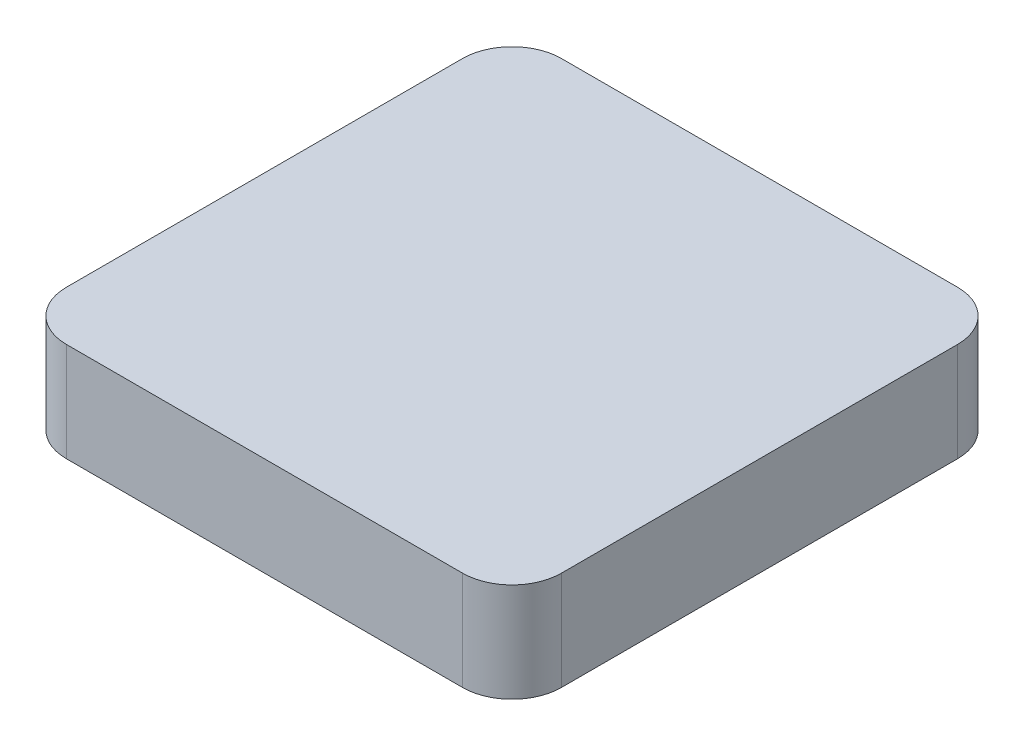
ISO-10303-21;
HEADER;
FILE_DESCRIPTION(('STEP AP214'),'2;1');
FILE_NAME('part.step','',(''),(''),'','','');
FILE_SCHEMA(('AUTOMOTIVE_DESIGN { 1 0 10303 214 1 1 1 1 }'));
ENDSEC;
DATA;
#1=APPLICATION_CONTEXT('core data for automotive mechanical design processes');
#2=APPLICATION_PROTOCOL_DEFINITION('international standard','automotive_design',2000,#1);
#3=PRODUCT_CONTEXT('',#1,'mechanical');
#4=PRODUCT('Part','Part','',(#3));
#5=PRODUCT_RELATED_PRODUCT_CATEGORY('part','',(#4));
#6=PRODUCT_DEFINITION_FORMATION('','',#4);
#7=PRODUCT_DEFINITION_CONTEXT('part definition',#1,'design');
#8=PRODUCT_DEFINITION('design','',#6,#7);
#9=PRODUCT_DEFINITION_SHAPE('','',#8);
#10=(LENGTH_UNIT() NAMED_UNIT(*) SI_UNIT(.MILLI.,.METRE.));
#11=(NAMED_UNIT(*) PLANE_ANGLE_UNIT() SI_UNIT($,.RADIAN.));
#12=(NAMED_UNIT(*) SI_UNIT($,.STERADIAN.) SOLID_ANGLE_UNIT());
#13=UNCERTAINTY_MEASURE_WITH_UNIT(LENGTH_MEASURE(1.E-05),#10,'distance_accuracy_value','');
#14=(GEOMETRIC_REPRESENTATION_CONTEXT(3) GLOBAL_UNCERTAINTY_ASSIGNED_CONTEXT((#13)) GLOBAL_UNIT_ASSIGNED_CONTEXT((#10,
#11,#12)) REPRESENTATION_CONTEXT('',''));
#15=CARTESIAN_POINT('',(0.,0.,0.));
#16=DIRECTION('',(0.,0.,1.));
#17=DIRECTION('',(1.,0.,0.));
#18=AXIS2_PLACEMENT_3D('',#15,#16,#17);
#19=CARTESIAN_POINT('',(-121.242683267555,1.,-137.570933988502));
#20=DIRECTION('',(1.,0.,0.));
#21=DIRECTION('',(0.,1.,0.));
#22=AXIS2_PLACEMENT_3D('',#19,#20,#21);
#23=PLANE('',#22);
#24=DIRECTION('',(0.,0.,1.));
#25=VECTOR('',#24,1.);
#26=CARTESIAN_POINT('',(-121.242683267555,0.,-137.570933988502));
#27=LINE('',#26,#25);
#28=CARTESIAN_POINT('',(-121.242683267555,0.,-137.070933988502));
#29=VERTEX_POINT('',#28);
#30=CARTESIAN_POINT('',(-121.242683267555,0.,-133.070933988502));
#31=VERTEX_POINT('',#30);
#32=EDGE_CURVE('E10',#29,#31,#27,.T.);
#33=ORIENTED_EDGE('',*,*,#32,.T.);
#34=DIRECTION('',(0.,1.,0.));
#35=VECTOR('',#34,1.);
#36=CARTESIAN_POINT('',(-121.242683267555,1.,-133.070933988502));
#37=LINE('',#36,#35);
#38=CARTESIAN_POINT('',(-121.242683267555,1.,-133.070933988502));
#39=VERTEX_POINT('',#38);
#40=EDGE_CURVE('E26',#31,#39,#37,.T.);
#41=ORIENTED_EDGE('',*,*,#40,.T.);
#42=DIRECTION('',(0.,0.,1.));
#43=VECTOR('',#42,1.);
#44=CARTESIAN_POINT('',(-121.242683267555,1.,-137.570933988502));
#45=LINE('',#44,#43);
#46=CARTESIAN_POINT('',(-121.242683267555,1.,-137.070933988502));
#47=VERTEX_POINT('',#46);
#48=EDGE_CURVE('E137',#47,#39,#45,.T.);
#49=ORIENTED_EDGE('',*,*,#48,.F.);
#50=DIRECTION('',(0.,-1.,0.));
#51=VECTOR('',#50,1.);
#52=CARTESIAN_POINT('',(-121.242683267555,1.,-137.070933988502));
#53=LINE('',#52,#51);
#54=EDGE_CURVE('E166',#47,#29,#53,.T.);
#55=ORIENTED_EDGE('',*,*,#54,.T.);
#56=EDGE_LOOP('',(#33,#41,#49,#55));
#57=FACE_BOUND('',#56,.T.);
#58=ADVANCED_FACE('F15',(#57),#23,.F.);
#59=CARTESIAN_POINT('',(-121.242683267555,1.,-132.570933988502));
#60=DIRECTION('',(0.,0.,-1.));
#61=DIRECTION('',(0.,-1.,0.));
#62=AXIS2_PLACEMENT_3D('',#59,#60,#61);
#63=PLANE('',#62);
#64=DIRECTION('',(1.,0.,0.));
#65=VECTOR('',#64,1.);
#66=CARTESIAN_POINT('',(-121.242683267555,0.,-132.570933988502));
#67=LINE('',#66,#65);
#68=CARTESIAN_POINT('',(-120.742683267555,0.,-132.570933988502));
#69=VERTEX_POINT('',#68);
#70=CARTESIAN_POINT('',(-116.742683267555,0.,-132.570933988502));
#71=VERTEX_POINT('',#70);
#72=EDGE_CURVE('E163',#69,#71,#67,.T.);
#73=ORIENTED_EDGE('',*,*,#72,.T.);
#74=DIRECTION('',(0.,1.,0.));
#75=VECTOR('',#74,1.);
#76=CARTESIAN_POINT('',(-116.742683267555,1.,-132.570933988502));
#77=LINE('',#76,#75);
#78=CARTESIAN_POINT('',(-116.742683267555,1.,-132.570933988502));
#79=VERTEX_POINT('',#78);
#80=EDGE_CURVE('E122',#71,#79,#77,.T.);
#81=ORIENTED_EDGE('',*,*,#80,.T.);
#82=DIRECTION('',(1.,0.,0.));
#83=VECTOR('',#82,1.);
#84=CARTESIAN_POINT('',(-121.242683267555,1.,-132.570933988502));
#85=LINE('',#84,#83);
#86=CARTESIAN_POINT('',(-120.742683267555,1.,-132.570933988502));
#87=VERTEX_POINT('',#86);
#88=EDGE_CURVE('E116',#87,#79,#85,.T.);
#89=ORIENTED_EDGE('',*,*,#88,.F.);
#90=DIRECTION('',(0.,-1.,0.));
#91=VECTOR('',#90,1.);
#92=CARTESIAN_POINT('',(-120.742683267555,1.,-132.570933988502));
#93=LINE('',#92,#91);
#94=EDGE_CURVE('E120',#87,#69,#93,.T.);
#95=ORIENTED_EDGE('',*,*,#94,.T.);
#96=EDGE_LOOP('',(#73,#81,#89,#95));
#97=FACE_BOUND('',#96,.T.);
#98=ADVANCED_FACE('F119',(#97),#63,.F.);
#99=CARTESIAN_POINT('',(-116.242683267555,1.,-137.570933988502));
#100=DIRECTION('',(-1.,0.,0.));
#101=DIRECTION('',(0.,0.,1.));
#102=AXIS2_PLACEMENT_3D('',#99,#100,#101);
#103=PLANE('',#102);
#104=DIRECTION('',(0.,0.,-1.));
#105=VECTOR('',#104,1.);
#106=CARTESIAN_POINT('',(-116.242683267555,1.,-137.570933988502));
#107=LINE('',#106,#105);
#108=CARTESIAN_POINT('',(-116.242683267555,1.,-133.070933988502));
#109=VERTEX_POINT('',#108);
#110=CARTESIAN_POINT('',(-116.242683267555,1.,-137.070933988502));
#111=VERTEX_POINT('',#110);
#112=EDGE_CURVE('E161',#109,#111,#107,.T.);
#113=ORIENTED_EDGE('',*,*,#112,.F.);
#114=DIRECTION('',(0.,-1.,0.));
#115=VECTOR('',#114,1.);
#116=CARTESIAN_POINT('',(-116.242683267555,1.,-133.070933988502));
#117=LINE('',#116,#115);
#118=CARTESIAN_POINT('',(-116.242683267555,0.,-133.070933988502));
#119=VERTEX_POINT('',#118);
#120=EDGE_CURVE('E19',#109,#119,#117,.T.);
#121=ORIENTED_EDGE('',*,*,#120,.T.);
#122=DIRECTION('',(0.,0.,-1.));
#123=VECTOR('',#122,1.);
#124=CARTESIAN_POINT('',(-116.242683267555,0.,-137.570933988502));
#125=LINE('',#124,#123);
#126=CARTESIAN_POINT('',(-116.242683267555,0.,-137.070933988502));
#127=VERTEX_POINT('',#126);
#128=EDGE_CURVE('E171',#119,#127,#125,.T.);
#129=ORIENTED_EDGE('',*,*,#128,.T.);
#130=DIRECTION('',(0.,1.,0.));
#131=VECTOR('',#130,1.);
#132=CARTESIAN_POINT('',(-116.242683267555,1.,-137.070933988502));
#133=LINE('',#132,#131);
#134=EDGE_CURVE('E159',#127,#111,#133,.T.);
#135=ORIENTED_EDGE('',*,*,#134,.T.);
#136=EDGE_LOOP('',(#113,#121,#129,#135));
#137=FACE_BOUND('',#136,.T.);
#138=ADVANCED_FACE('F277',(#137),#103,.F.);
#139=CARTESIAN_POINT('',(-121.242683267555,1.,-137.570933988502));
#140=DIRECTION('',(0.,0.,1.));
#141=DIRECTION('',(1.,0.,0.));
#142=AXIS2_PLACEMENT_3D('',#139,#140,#141);
#143=PLANE('',#142);
#144=DIRECTION('',(-1.,0.,0.));
#145=VECTOR('',#144,1.);
#146=CARTESIAN_POINT('',(-121.242683267555,0.,-137.570933988502));
#147=LINE('',#146,#145);
#148=CARTESIAN_POINT('',(-116.742683267555,0.,-137.570933988502));
#149=VERTEX_POINT('',#148);
#150=CARTESIAN_POINT('',(-120.742683267555,0.,-137.570933988502));
#151=VERTEX_POINT('',#150);
#152=EDGE_CURVE('E156',#149,#151,#147,.T.);
#153=ORIENTED_EDGE('',*,*,#152,.T.);
#154=DIRECTION('',(0.,1.,0.));
#155=VECTOR('',#154,1.);
#156=CARTESIAN_POINT('',(-120.742683267555,1.,-137.570933988502));
#157=LINE('',#156,#155);
#158=CARTESIAN_POINT('',(-120.742683267555,1.,-137.570933988502));
#159=VERTEX_POINT('',#158);
#160=EDGE_CURVE('E68',#151,#159,#157,.T.);
#161=ORIENTED_EDGE('',*,*,#160,.T.);
#162=DIRECTION('',(-1.,0.,0.));
#163=VECTOR('',#162,1.);
#164=CARTESIAN_POINT('',(-121.242683267555,1.,-137.570933988502));
#165=LINE('',#164,#163);
#166=CARTESIAN_POINT('',(-116.742683267555,1.,-137.570933988502));
#167=VERTEX_POINT('',#166);
#168=EDGE_CURVE('E82',#167,#159,#165,.T.);
#169=ORIENTED_EDGE('',*,*,#168,.F.);
#170=DIRECTION('',(0.,-1.,0.));
#171=VECTOR('',#170,1.);
#172=CARTESIAN_POINT('',(-116.742683267555,1.,-137.570933988502));
#173=LINE('',#172,#171);
#174=EDGE_CURVE('E127',#167,#149,#173,.T.);
#175=ORIENTED_EDGE('',*,*,#174,.T.);
#176=EDGE_LOOP('',(#153,#161,#169,#175));
#177=FACE_BOUND('',#176,.T.);
#178=ADVANCED_FACE('F281',(#177),#143,.F.);
#179=CARTESIAN_POINT('',(0.,1.,0.));
#180=DIRECTION('',(0.,1.,0.));
#181=DIRECTION('',(1.,0.,0.));
#182=AXIS2_PLACEMENT_3D('',#179,#180,#181);
#183=PLANE('',#182);
#184=ORIENTED_EDGE('',*,*,#88,.T.);
#185=CARTESIAN_POINT('',(-116.742683267555,1.,-133.070933988502));
#186=DIRECTION('',(0.,1.,0.));
#187=DIRECTION('',(0.,0.,1.));
#188=AXIS2_PLACEMENT_3D('',#185,#186,#187);
#189=CIRCLE('',#188,0.5);
#190=EDGE_CURVE('E128',#79,#109,#189,.T.);
#191=ORIENTED_EDGE('',*,*,#190,.T.);
#192=ORIENTED_EDGE('',*,*,#112,.T.);
#193=CARTESIAN_POINT('',(-116.742683267555,1.,-137.070933988502));
#194=DIRECTION('',(0.,1.,0.));
#195=DIRECTION('',(0.,0.,1.));
#196=AXIS2_PLACEMENT_3D('',#193,#194,#195);
#197=CIRCLE('',#196,0.5);
#198=EDGE_CURVE('E152',#111,#167,#197,.T.);
#199=ORIENTED_EDGE('',*,*,#198,.T.);
#200=ORIENTED_EDGE('',*,*,#168,.T.);
#201=CARTESIAN_POINT('',(-120.742683267555,1.,-137.070933988502));
#202=DIRECTION('',(0.,1.,0.));
#203=DIRECTION('',(0.,0.,1.));
#204=AXIS2_PLACEMENT_3D('',#201,#202,#203);
#205=CIRCLE('',#204,0.5);
#206=EDGE_CURVE('E146',#159,#47,#205,.T.);
#207=ORIENTED_EDGE('',*,*,#206,.T.);
#208=ORIENTED_EDGE('',*,*,#48,.T.);
#209=CARTESIAN_POINT('',(-120.742683267555,1.,-133.070933988502));
#210=DIRECTION('',(0.,1.,0.));
#211=DIRECTION('',(0.,0.,1.));
#212=AXIS2_PLACEMENT_3D('',#209,#210,#211);
#213=CIRCLE('',#212,0.5);
#214=EDGE_CURVE('E131',#39,#87,#213,.T.);
#215=ORIENTED_EDGE('',*,*,#214,.T.);
#216=EDGE_LOOP('',(#184,#191,#192,#199,#200,#207,#208,#215));
#217=FACE_BOUND('',#216,.T.);
#218=ADVANCED_FACE('F136',(#217),#183,.T.);
#219=CARTESIAN_POINT('',(0.,0.,0.));
#220=DIRECTION('',(0.,1.,0.));
#221=DIRECTION('',(1.,0.,0.));
#222=AXIS2_PLACEMENT_3D('',#219,#220,#221);
#223=PLANE('',#222);
#224=ORIENTED_EDGE('',*,*,#128,.F.);
#225=CARTESIAN_POINT('',(-116.742683267555,0.,-133.070933988502));
#226=DIRECTION('',(0.,-1.,0.));
#227=DIRECTION('',(0.,0.,1.));
#228=AXIS2_PLACEMENT_3D('',#225,#226,#227);
#229=CIRCLE('',#228,0.5);
#230=EDGE_CURVE('E139',#119,#71,#229,.T.);
#231=ORIENTED_EDGE('',*,*,#230,.T.);
#232=ORIENTED_EDGE('',*,*,#72,.F.);
#233=CARTESIAN_POINT('',(-120.742683267555,0.,-133.070933988502));
#234=DIRECTION('',(0.,-1.,0.));
#235=DIRECTION('',(0.,0.,1.));
#236=AXIS2_PLACEMENT_3D('',#233,#234,#235);
#237=CIRCLE('',#236,0.5);
#238=EDGE_CURVE('E133',#69,#31,#237,.T.);
#239=ORIENTED_EDGE('',*,*,#238,.T.);
#240=ORIENTED_EDGE('',*,*,#32,.F.);
#241=CARTESIAN_POINT('',(-120.742683267555,0.,-137.070933988502));
#242=DIRECTION('',(0.,-1.,0.));
#243=DIRECTION('',(0.,0.,1.));
#244=AXIS2_PLACEMENT_3D('',#241,#242,#243);
#245=CIRCLE('',#244,0.5);
#246=EDGE_CURVE('E154',#29,#151,#245,.T.);
#247=ORIENTED_EDGE('',*,*,#246,.T.);
#248=ORIENTED_EDGE('',*,*,#152,.F.);
#249=CARTESIAN_POINT('',(-116.742683267555,0.,-137.070933988502));
#250=DIRECTION('',(0.,-1.,0.));
#251=DIRECTION('',(0.,0.,1.));
#252=AXIS2_PLACEMENT_3D('',#249,#250,#251);
#253=CIRCLE('',#252,0.5);
#254=EDGE_CURVE('E177',#149,#127,#253,.T.);
#255=ORIENTED_EDGE('',*,*,#254,.T.);
#256=EDGE_LOOP('',(#224,#231,#232,#239,#240,#247,#248,#255));
#257=FACE_BOUND('',#256,.T.);
#258=ADVANCED_FACE('F297',(#257),#223,.F.);
#259=CARTESIAN_POINT('',(-116.742683267555,1.,-133.070933988502));
#260=DIRECTION('',(0.,-1.,0.));
#261=DIRECTION('',(0.,0.,-1.));
#262=AXIS2_PLACEMENT_3D('',#259,#260,#261);
#263=CYLINDRICAL_SURFACE('',#262,0.5);
#264=ORIENTED_EDGE('',*,*,#190,.F.);
#265=ORIENTED_EDGE('',*,*,#80,.F.);
#266=ORIENTED_EDGE('',*,*,#230,.F.);
#267=ORIENTED_EDGE('',*,*,#120,.F.);
#268=EDGE_LOOP('',(#264,#265,#266,#267));
#269=FACE_BOUND('',#268,.T.);
#270=ADVANCED_FACE('F312',(#269),#263,.T.);
#271=CARTESIAN_POINT('',(-120.742683267555,1.,-133.070933988502));
#272=DIRECTION('',(0.,-1.,0.));
#273=DIRECTION('',(0.,0.,-1.));
#274=AXIS2_PLACEMENT_3D('',#271,#272,#273);
#275=CYLINDRICAL_SURFACE('',#274,0.5);
#276=ORIENTED_EDGE('',*,*,#214,.F.);
#277=ORIENTED_EDGE('',*,*,#40,.F.);
#278=ORIENTED_EDGE('',*,*,#238,.F.);
#279=ORIENTED_EDGE('',*,*,#94,.F.);
#280=EDGE_LOOP('',(#276,#277,#278,#279));
#281=FACE_BOUND('',#280,.T.);
#282=ADVANCED_FACE('F130',(#281),#275,.T.);
#283=CARTESIAN_POINT('',(-120.742683267555,1.,-137.070933988502));
#284=DIRECTION('',(0.,-1.,0.));
#285=DIRECTION('',(0.,0.,-1.));
#286=AXIS2_PLACEMENT_3D('',#283,#284,#285);
#287=CYLINDRICAL_SURFACE('',#286,0.5);
#288=ORIENTED_EDGE('',*,*,#206,.F.);
#289=ORIENTED_EDGE('',*,*,#160,.F.);
#290=ORIENTED_EDGE('',*,*,#246,.F.);
#291=ORIENTED_EDGE('',*,*,#54,.F.);
#292=EDGE_LOOP('',(#288,#289,#290,#291));
#293=FACE_BOUND('',#292,.T.);
#294=ADVANCED_FACE('F336',(#293),#287,.T.);
#295=CARTESIAN_POINT('',(-116.742683267555,1.,-137.070933988502));
#296=DIRECTION('',(0.,-1.,0.));
#297=DIRECTION('',(0.,0.,-1.));
#298=AXIS2_PLACEMENT_3D('',#295,#296,#297);
#299=CYLINDRICAL_SURFACE('',#298,0.5);
#300=ORIENTED_EDGE('',*,*,#198,.F.);
#301=ORIENTED_EDGE('',*,*,#134,.F.);
#302=ORIENTED_EDGE('',*,*,#254,.F.);
#303=ORIENTED_EDGE('',*,*,#174,.F.);
#304=EDGE_LOOP('',(#300,#301,#302,#303));
#305=FACE_BOUND('',#304,.T.);
#306=ADVANCED_FACE('F17',(#305),#299,.T.);
#307=CLOSED_SHELL('',(#58,#98,#138,#178,#218,#258,#270,#282,#294,#306));
#308=MANIFOLD_SOLID_BREP('B1',#307);
#309=ADVANCED_BREP_SHAPE_REPRESENTATION('',(#18,#308),#14);
#310=SHAPE_DEFINITION_REPRESENTATION(#9,#309);
ENDSEC;
END-ISO-10303-21;
